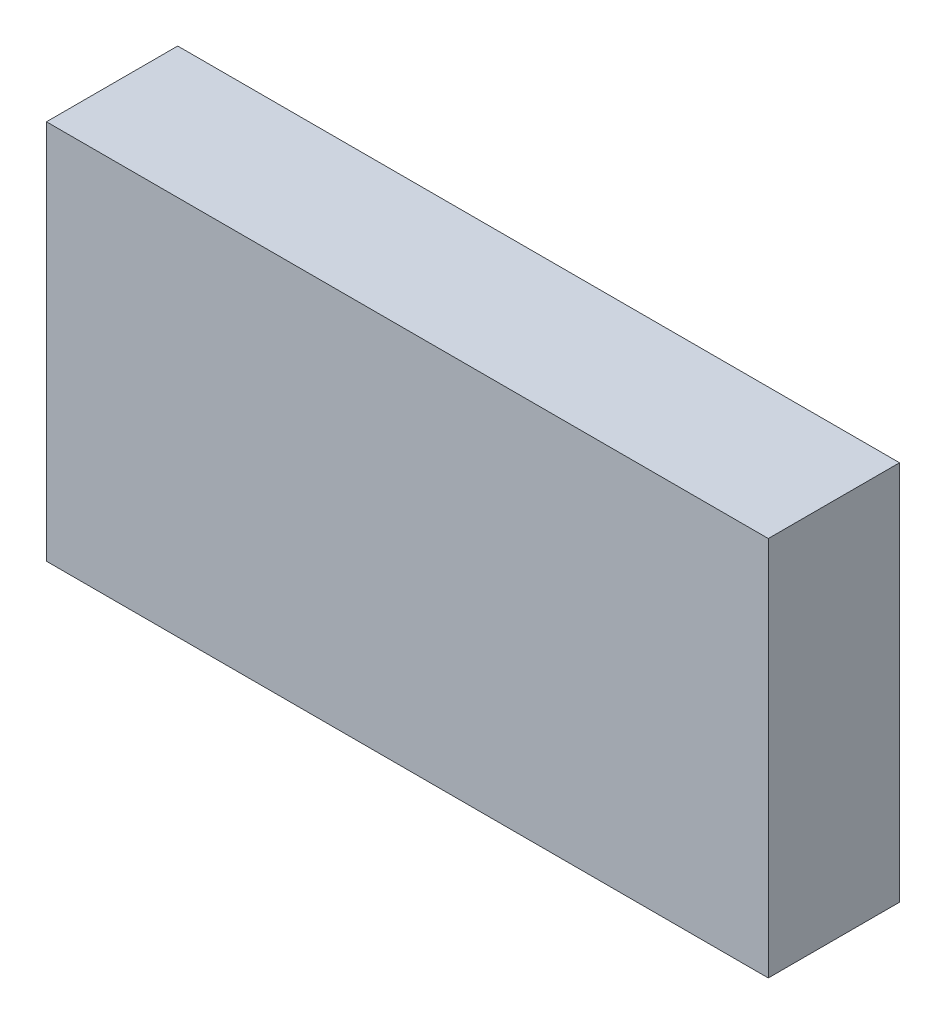
ISO-10303-21;
HEADER;
FILE_DESCRIPTION(('STEP AP214'),'2;1');
FILE_NAME('part.step','',(''),(''),'','','');
FILE_SCHEMA(('AUTOMOTIVE_DESIGN { 1 0 10303 214 1 1 1 1 }'));
ENDSEC;
DATA;
#1=APPLICATION_CONTEXT('core data for automotive mechanical design processes');
#2=APPLICATION_PROTOCOL_DEFINITION('international standard','automotive_design',2000,#1);
#3=PRODUCT_CONTEXT('',#1,'mechanical');
#4=PRODUCT('Part','Part','',(#3));
#5=PRODUCT_RELATED_PRODUCT_CATEGORY('part','',(#4));
#6=PRODUCT_DEFINITION_FORMATION('','',#4);
#7=PRODUCT_DEFINITION_CONTEXT('part definition',#1,'design');
#8=PRODUCT_DEFINITION('design','',#6,#7);
#9=PRODUCT_DEFINITION_SHAPE('','',#8);
#10=(LENGTH_UNIT() NAMED_UNIT(*) SI_UNIT(.MILLI.,.METRE.));
#11=(NAMED_UNIT(*) PLANE_ANGLE_UNIT() SI_UNIT($,.RADIAN.));
#12=(NAMED_UNIT(*) SI_UNIT($,.STERADIAN.) SOLID_ANGLE_UNIT());
#13=UNCERTAINTY_MEASURE_WITH_UNIT(LENGTH_MEASURE(1.E-05),#10,'distance_accuracy_value','');
#14=(GEOMETRIC_REPRESENTATION_CONTEXT(3) GLOBAL_UNCERTAINTY_ASSIGNED_CONTEXT((#13)) GLOBAL_UNIT_ASSIGNED_CONTEXT((#10,
#11,#12)) REPRESENTATION_CONTEXT('',''));
#15=CARTESIAN_POINT('',(0.,0.,0.));
#16=DIRECTION('',(0.,0.,1.));
#17=DIRECTION('',(1.,0.,0.));
#18=AXIS2_PLACEMENT_3D('',#15,#16,#17);
#19=CARTESIAN_POINT('',(0.,0.,10.));
#20=DIRECTION('',(1.,0.,0.));
#21=DIRECTION('',(0.,0.,-1.));
#22=AXIS2_PLACEMENT_3D('',#19,#20,#21);
#23=PLANE('',#22);
#24=DIRECTION('',(0.,-1.,0.));
#25=VECTOR('',#24,1.);
#26=CARTESIAN_POINT('',(0.,0.,0.));
#27=LINE('',#26,#25);
#28=CARTESIAN_POINT('',(0.,29.,0.));
#29=VERTEX_POINT('',#28);
#30=CARTESIAN_POINT('',(0.,0.,0.));
#31=VERTEX_POINT('',#30);
#32=EDGE_CURVE('E107',#29,#31,#27,.T.);
#33=ORIENTED_EDGE('',*,*,#32,.T.);
#34=DIRECTION('',(0.,0.,-1.));
#35=VECTOR('',#34,1.);
#36=CARTESIAN_POINT('',(0.,0.,10.));
#37=LINE('',#36,#35);
#38=CARTESIAN_POINT('',(0.,0.,10.));
#39=VERTEX_POINT('',#38);
#40=EDGE_CURVE('E11',#39,#31,#37,.T.);
#41=ORIENTED_EDGE('',*,*,#40,.F.);
#42=DIRECTION('',(0.,-1.,0.));
#43=VECTOR('',#42,1.);
#44=CARTESIAN_POINT('',(0.,0.,10.));
#45=LINE('',#44,#43);
#46=CARTESIAN_POINT('',(0.,29.,10.));
#47=VERTEX_POINT('',#46);
#48=EDGE_CURVE('E91',#47,#39,#45,.T.);
#49=ORIENTED_EDGE('',*,*,#48,.F.);
#50=DIRECTION('',(0.,0.,-1.));
#51=VECTOR('',#50,1.);
#52=CARTESIAN_POINT('',(0.,29.,10.));
#53=LINE('',#52,#51);
#54=EDGE_CURVE('E103',#47,#29,#53,.T.);
#55=ORIENTED_EDGE('',*,*,#54,.T.);
#56=EDGE_LOOP('',(#33,#41,#49,#55));
#57=FACE_BOUND('',#56,.T.);
#58=ADVANCED_FACE('F39',(#57),#23,.F.);
#59=CARTESIAN_POINT('',(0.,0.,10.));
#60=DIRECTION('',(0.,1.,0.));
#61=DIRECTION('',(0.,0.,1.));
#62=AXIS2_PLACEMENT_3D('',#59,#60,#61);
#63=PLANE('',#62);
#64=DIRECTION('',(1.,0.,0.));
#65=VECTOR('',#64,1.);
#66=CARTESIAN_POINT('',(0.,0.,0.));
#67=LINE('',#66,#65);
#68=CARTESIAN_POINT('',(55.,0.,0.));
#69=VERTEX_POINT('',#68);
#70=EDGE_CURVE('E96',#31,#69,#67,.T.);
#71=ORIENTED_EDGE('',*,*,#70,.T.);
#72=DIRECTION('',(0.,0.,-1.));
#73=VECTOR('',#72,1.);
#74=CARTESIAN_POINT('',(55.,0.,10.));
#75=LINE('',#74,#73);
#76=CARTESIAN_POINT('',(55.,0.,10.));
#77=VERTEX_POINT('',#76);
#78=EDGE_CURVE('E48',#77,#69,#75,.T.);
#79=ORIENTED_EDGE('',*,*,#78,.F.);
#80=DIRECTION('',(1.,0.,0.));
#81=VECTOR('',#80,1.);
#82=CARTESIAN_POINT('',(0.,0.,10.));
#83=LINE('',#82,#81);
#84=EDGE_CURVE('E86',#39,#77,#83,.T.);
#85=ORIENTED_EDGE('',*,*,#84,.F.);
#86=ORIENTED_EDGE('',*,*,#40,.T.);
#87=EDGE_LOOP('',(#71,#79,#85,#86));
#88=FACE_BOUND('',#87,.T.);
#89=ADVANCED_FACE('F95',(#88),#63,.F.);
#90=CARTESIAN_POINT('',(55.,0.,10.));
#91=DIRECTION('',(-1.,0.,0.));
#92=DIRECTION('',(0.,0.,1.));
#93=AXIS2_PLACEMENT_3D('',#90,#91,#92);
#94=PLANE('',#93);
#95=DIRECTION('',(0.,1.,0.));
#96=VECTOR('',#95,1.);
#97=CARTESIAN_POINT('',(55.,0.,0.));
#98=LINE('',#97,#96);
#99=CARTESIAN_POINT('',(55.,29.,0.));
#100=VERTEX_POINT('',#99);
#101=EDGE_CURVE('E73',#69,#100,#98,.T.);
#102=ORIENTED_EDGE('',*,*,#101,.T.);
#103=DIRECTION('',(0.,0.,-1.));
#104=VECTOR('',#103,1.);
#105=CARTESIAN_POINT('',(55.,29.,10.));
#106=LINE('',#105,#104);
#107=CARTESIAN_POINT('',(55.,29.,10.));
#108=VERTEX_POINT('',#107);
#109=EDGE_CURVE('E98',#108,#100,#106,.T.);
#110=ORIENTED_EDGE('',*,*,#109,.F.);
#111=DIRECTION('',(0.,1.,0.));
#112=VECTOR('',#111,1.);
#113=CARTESIAN_POINT('',(55.,0.,10.));
#114=LINE('',#113,#112);
#115=EDGE_CURVE('E89',#77,#108,#114,.T.);
#116=ORIENTED_EDGE('',*,*,#115,.F.);
#117=ORIENTED_EDGE('',*,*,#78,.T.);
#118=EDGE_LOOP('',(#102,#110,#116,#117));
#119=FACE_BOUND('',#118,.T.);
#120=ADVANCED_FACE('F99',(#119),#94,.F.);
#121=CARTESIAN_POINT('',(0.,29.,10.));
#122=DIRECTION('',(0.,-1.,0.));
#123=DIRECTION('',(0.,0.,-1.));
#124=AXIS2_PLACEMENT_3D('',#121,#122,#123);
#125=PLANE('',#124);
#126=DIRECTION('',(-1.,0.,0.));
#127=VECTOR('',#126,1.);
#128=CARTESIAN_POINT('',(0.,29.,0.));
#129=LINE('',#128,#127);
#130=EDGE_CURVE('E79',#100,#29,#129,.T.);
#131=ORIENTED_EDGE('',*,*,#130,.T.);
#132=ORIENTED_EDGE('',*,*,#54,.F.);
#133=DIRECTION('',(-1.,0.,0.));
#134=VECTOR('',#133,1.);
#135=CARTESIAN_POINT('',(0.,29.,10.));
#136=LINE('',#135,#134);
#137=EDGE_CURVE('E56',#108,#47,#136,.T.);
#138=ORIENTED_EDGE('',*,*,#137,.F.);
#139=ORIENTED_EDGE('',*,*,#109,.T.);
#140=EDGE_LOOP('',(#131,#132,#138,#139));
#141=FACE_BOUND('',#140,.T.);
#142=ADVANCED_FACE('F120',(#141),#125,.F.);
#143=CARTESIAN_POINT('',(0.,0.,10.));
#144=DIRECTION('',(0.,0.,-1.));
#145=DIRECTION('',(-1.,0.,0.));
#146=AXIS2_PLACEMENT_3D('',#143,#144,#145);
#147=PLANE('',#146);
#148=ORIENTED_EDGE('',*,*,#48,.T.);
#149=ORIENTED_EDGE('',*,*,#84,.T.);
#150=ORIENTED_EDGE('',*,*,#115,.T.);
#151=ORIENTED_EDGE('',*,*,#137,.T.);
#152=EDGE_LOOP('',(#148,#149,#150,#151));
#153=FACE_BOUND('',#152,.T.);
#154=ADVANCED_FACE('F87',(#153),#147,.F.);
#155=CARTESIAN_POINT('',(0.,0.,0.));
#156=DIRECTION('',(0.,0.,-1.));
#157=DIRECTION('',(-1.,0.,0.));
#158=AXIS2_PLACEMENT_3D('',#155,#156,#157);
#159=PLANE('',#158);
#160=ORIENTED_EDGE('',*,*,#32,.F.);
#161=ORIENTED_EDGE('',*,*,#130,.F.);
#162=ORIENTED_EDGE('',*,*,#101,.F.);
#163=ORIENTED_EDGE('',*,*,#70,.F.);
#164=EDGE_LOOP('',(#160,#161,#162,#163));
#165=FACE_BOUND('',#164,.T.);
#166=ADVANCED_FACE('F123',(#165),#159,.T.);
#167=CLOSED_SHELL('',(#58,#89,#120,#142,#154,#166));
#168=MANIFOLD_SOLID_BREP('B2',#167);
#169=ADVANCED_BREP_SHAPE_REPRESENTATION('',(#18,#168),#14);
#170=SHAPE_DEFINITION_REPRESENTATION(#9,#169);
ENDSEC;
END-ISO-10303-21;
